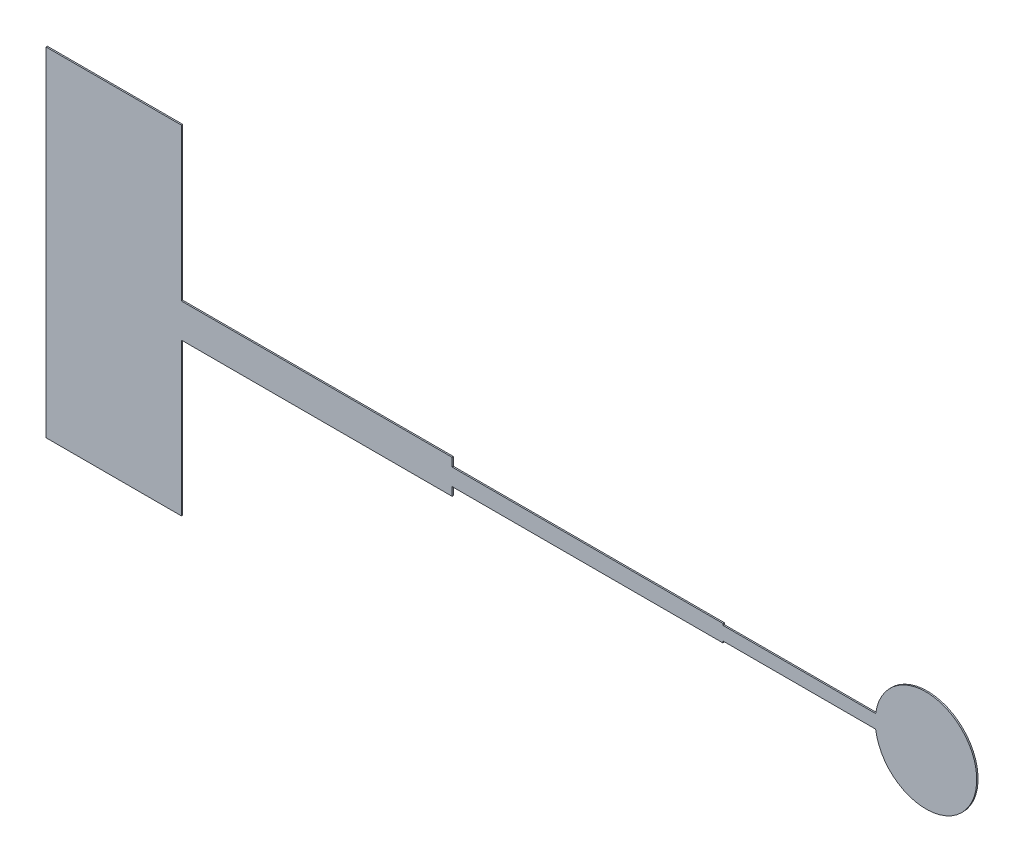
ISO-10303-21;
HEADER;
FILE_DESCRIPTION(('STEP AP214'),'2;1');
FILE_NAME('part.step','',(''),(''),'','','');
FILE_SCHEMA(('AUTOMOTIVE_DESIGN { 1 0 10303 214 1 1 1 1 }'));
ENDSEC;
DATA;
#1=APPLICATION_CONTEXT('core data for automotive mechanical design processes');
#2=APPLICATION_PROTOCOL_DEFINITION('international standard','automotive_design',2000,#1);
#3=PRODUCT_CONTEXT('',#1,'mechanical');
#4=PRODUCT('Part','Part','',(#3));
#5=PRODUCT_RELATED_PRODUCT_CATEGORY('part','',(#4));
#6=PRODUCT_DEFINITION_FORMATION('','',#4);
#7=PRODUCT_DEFINITION_CONTEXT('part definition',#1,'design');
#8=PRODUCT_DEFINITION('design','',#6,#7);
#9=PRODUCT_DEFINITION_SHAPE('','',#8);
#10=(LENGTH_UNIT() NAMED_UNIT(*) SI_UNIT(.MILLI.,.METRE.));
#11=(NAMED_UNIT(*) PLANE_ANGLE_UNIT() SI_UNIT($,.RADIAN.));
#12=(NAMED_UNIT(*) SI_UNIT($,.STERADIAN.) SOLID_ANGLE_UNIT());
#13=UNCERTAINTY_MEASURE_WITH_UNIT(LENGTH_MEASURE(1.E-05),#10,'distance_accuracy_value','');
#14=(GEOMETRIC_REPRESENTATION_CONTEXT(3) GLOBAL_UNCERTAINTY_ASSIGNED_CONTEXT((#13)) GLOBAL_UNIT_ASSIGNED_CONTEXT((#10,
#11,#12)) REPRESENTATION_CONTEXT('',''));
#15=CARTESIAN_POINT('',(0.,0.,0.));
#16=DIRECTION('',(0.,0.,1.));
#17=DIRECTION('',(1.,0.,0.));
#18=AXIS2_PLACEMENT_3D('',#15,#16,#17);
#19=CARTESIAN_POINT('',(1000.,-250.,-20.));
#20=DIRECTION('',(1.,0.,0.));
#21=DIRECTION('',(0.,1.,0.));
#22=AXIS2_PLACEMENT_3D('',#19,#20,#21);
#23=PLANE('',#22);
#24=DIRECTION('',(0.,1.,0.));
#25=VECTOR('',#24,1.);
#26=CARTESIAN_POINT('',(1000.,-250.,0.));
#27=LINE('',#26,#25);
#28=CARTESIAN_POINT('',(1000.,-2500.,0.));
#29=VERTEX_POINT('',#28);
#30=CARTESIAN_POINT('',(1000.,-250.,0.));
#31=VERTEX_POINT('',#30);
#32=EDGE_CURVE('E194',#29,#31,#27,.T.);
#33=ORIENTED_EDGE('',*,*,#32,.F.);
#34=DIRECTION('',(0.,0.,1.));
#35=VECTOR('',#34,1.);
#36=CARTESIAN_POINT('',(1000.,-2500.,-20.));
#37=LINE('',#36,#35);
#38=CARTESIAN_POINT('',(1000.,-2500.,-20.));
#39=VERTEX_POINT('',#38);
#40=EDGE_CURVE('E11',#39,#29,#37,.T.);
#41=ORIENTED_EDGE('',*,*,#40,.F.);
#42=DIRECTION('',(0.,1.,0.));
#43=VECTOR('',#42,1.);
#44=CARTESIAN_POINT('',(1000.,-250.,-20.));
#45=LINE('',#44,#43);
#46=CARTESIAN_POINT('',(1000.,-250.,-20.));
#47=VERTEX_POINT('',#46);
#48=EDGE_CURVE('E254',#39,#47,#45,.T.);
#49=ORIENTED_EDGE('',*,*,#48,.T.);
#50=DIRECTION('',(0.,0.,1.));
#51=VECTOR('',#50,1.);
#52=CARTESIAN_POINT('',(1000.,-250.,-20.));
#53=LINE('',#52,#51);
#54=EDGE_CURVE('E46',#47,#31,#53,.T.);
#55=ORIENTED_EDGE('',*,*,#54,.T.);
#56=EDGE_LOOP('',(#33,#41,#49,#55));
#57=FACE_BOUND('',#56,.T.);
#58=ADVANCED_FACE('F43',(#57),#23,.T.);
#59=CARTESIAN_POINT('',(-1000.,-2500.,-20.));
#60=DIRECTION('',(0.,-1.,0.));
#61=DIRECTION('',(0.,0.,-1.));
#62=AXIS2_PLACEMENT_3D('',#59,#60,#61);
#63=PLANE('',#62);
#64=DIRECTION('',(1.,0.,0.));
#65=VECTOR('',#64,1.);
#66=CARTESIAN_POINT('',(-1000.,-2500.,0.));
#67=LINE('',#66,#65);
#68=CARTESIAN_POINT('',(-1000.,-2500.,0.));
#69=VERTEX_POINT('',#68);
#70=EDGE_CURVE('E251',#69,#29,#67,.T.);
#71=ORIENTED_EDGE('',*,*,#70,.F.);
#72=DIRECTION('',(0.,0.,1.));
#73=VECTOR('',#72,1.);
#74=CARTESIAN_POINT('',(-1000.,-2500.,-20.));
#75=LINE('',#74,#73);
#76=CARTESIAN_POINT('',(-1000.,-2500.,-20.));
#77=VERTEX_POINT('',#76);
#78=EDGE_CURVE('E53',#77,#69,#75,.T.);
#79=ORIENTED_EDGE('',*,*,#78,.F.);
#80=DIRECTION('',(1.,0.,0.));
#81=VECTOR('',#80,1.);
#82=CARTESIAN_POINT('',(-1000.,-2500.,-20.));
#83=LINE('',#82,#81);
#84=EDGE_CURVE('E180',#77,#39,#83,.T.);
#85=ORIENTED_EDGE('',*,*,#84,.T.);
#86=ORIENTED_EDGE('',*,*,#40,.T.);
#87=EDGE_LOOP('',(#71,#79,#85,#86));
#88=FACE_BOUND('',#87,.T.);
#89=ADVANCED_FACE('F296',(#88),#63,.T.);
#90=CARTESIAN_POINT('',(-1000.,2500.,-20.));
#91=DIRECTION('',(-1.,0.,0.));
#92=DIRECTION('',(0.,-1.,0.));
#93=AXIS2_PLACEMENT_3D('',#90,#91,#92);
#94=PLANE('',#93);
#95=DIRECTION('',(0.,-1.,0.));
#96=VECTOR('',#95,1.);
#97=CARTESIAN_POINT('',(-1000.,2500.,0.));
#98=LINE('',#97,#96);
#99=CARTESIAN_POINT('',(-1000.,2500.,0.));
#100=VERTEX_POINT('',#99);
#101=EDGE_CURVE('E166',#100,#69,#98,.T.);
#102=ORIENTED_EDGE('',*,*,#101,.F.);
#103=DIRECTION('',(0.,0.,1.));
#104=VECTOR('',#103,1.);
#105=CARTESIAN_POINT('',(-1000.,2500.,-20.));
#106=LINE('',#105,#104);
#107=CARTESIAN_POINT('',(-1000.,2500.,-20.));
#108=VERTEX_POINT('',#107);
#109=EDGE_CURVE('E161',#108,#100,#106,.T.);
#110=ORIENTED_EDGE('',*,*,#109,.F.);
#111=DIRECTION('',(0.,-1.,0.));
#112=VECTOR('',#111,1.);
#113=CARTESIAN_POINT('',(-1000.,2500.,-20.));
#114=LINE('',#113,#112);
#115=EDGE_CURVE('E164',#108,#77,#114,.T.);
#116=ORIENTED_EDGE('',*,*,#115,.T.);
#117=ORIENTED_EDGE('',*,*,#78,.T.);
#118=EDGE_LOOP('',(#102,#110,#116,#117));
#119=FACE_BOUND('',#118,.T.);
#120=ADVANCED_FACE('F163',(#119),#94,.T.);
#121=CARTESIAN_POINT('',(-1000.,2500.,-20.));
#122=DIRECTION('',(0.,1.,0.));
#123=DIRECTION('',(0.,0.,1.));
#124=AXIS2_PLACEMENT_3D('',#121,#122,#123);
#125=PLANE('',#124);
#126=DIRECTION('',(-1.,0.,0.));
#127=VECTOR('',#126,1.);
#128=CARTESIAN_POINT('',(-1000.,2500.,0.));
#129=LINE('',#128,#127);
#130=CARTESIAN_POINT('',(1000.,2500.,0.));
#131=VERTEX_POINT('',#130);
#132=EDGE_CURVE('E246',#131,#100,#129,.T.);
#133=ORIENTED_EDGE('',*,*,#132,.F.);
#134=DIRECTION('',(0.,0.,1.));
#135=VECTOR('',#134,1.);
#136=CARTESIAN_POINT('',(1000.,2500.,-20.));
#137=LINE('',#136,#135);
#138=CARTESIAN_POINT('',(1000.,2500.,-20.));
#139=VERTEX_POINT('',#138);
#140=EDGE_CURVE('E172',#139,#131,#137,.T.);
#141=ORIENTED_EDGE('',*,*,#140,.F.);
#142=DIRECTION('',(-1.,0.,0.));
#143=VECTOR('',#142,1.);
#144=CARTESIAN_POINT('',(-1000.,2500.,-20.));
#145=LINE('',#144,#143);
#146=EDGE_CURVE('E178',#139,#108,#145,.T.);
#147=ORIENTED_EDGE('',*,*,#146,.T.);
#148=ORIENTED_EDGE('',*,*,#109,.T.);
#149=EDGE_LOOP('',(#133,#141,#147,#148));
#150=FACE_BOUND('',#149,.T.);
#151=ADVANCED_FACE('F183',(#150),#125,.T.);
#152=CARTESIAN_POINT('',(1000.,2500.,-20.));
#153=DIRECTION('',(1.,0.,0.));
#154=DIRECTION('',(0.,1.,0.));
#155=AXIS2_PLACEMENT_3D('',#152,#153,#154);
#156=PLANE('',#155);
#157=DIRECTION('',(0.,1.,0.));
#158=VECTOR('',#157,1.);
#159=CARTESIAN_POINT('',(1000.,2500.,0.));
#160=LINE('',#159,#158);
#161=CARTESIAN_POINT('',(1000.,250.,0.));
#162=VERTEX_POINT('',#161);
#163=EDGE_CURVE('E242',#162,#131,#160,.T.);
#164=ORIENTED_EDGE('',*,*,#163,.F.);
#165=DIRECTION('',(0.,0.,1.));
#166=VECTOR('',#165,1.);
#167=CARTESIAN_POINT('',(1000.,250.,-20.));
#168=LINE('',#167,#166);
#169=CARTESIAN_POINT('',(1000.,250.,-20.));
#170=VERTEX_POINT('',#169);
#171=EDGE_CURVE('E260',#170,#162,#168,.T.);
#172=ORIENTED_EDGE('',*,*,#171,.F.);
#173=DIRECTION('',(0.,1.,0.));
#174=VECTOR('',#173,1.);
#175=CARTESIAN_POINT('',(1000.,2500.,-20.));
#176=LINE('',#175,#174);
#177=EDGE_CURVE('E185',#170,#139,#176,.T.);
#178=ORIENTED_EDGE('',*,*,#177,.T.);
#179=ORIENTED_EDGE('',*,*,#140,.T.);
#180=EDGE_LOOP('',(#164,#172,#178,#179));
#181=FACE_BOUND('',#180,.T.);
#182=ADVANCED_FACE('F309',(#181),#156,.T.);
#183=CARTESIAN_POINT('',(1000.,250.,-20.));
#184=DIRECTION('',(0.,1.,0.));
#185=DIRECTION('',(0.,0.,1.));
#186=AXIS2_PLACEMENT_3D('',#183,#184,#185);
#187=PLANE('',#186);
#188=DIRECTION('',(-1.,0.,0.));
#189=VECTOR('',#188,1.);
#190=CARTESIAN_POINT('',(1000.,250.,0.));
#191=LINE('',#190,#189);
#192=CARTESIAN_POINT('',(5000.,250.,0.));
#193=VERTEX_POINT('',#192);
#194=EDGE_CURVE('E238',#193,#162,#191,.T.);
#195=ORIENTED_EDGE('',*,*,#194,.F.);
#196=DIRECTION('',(0.,0.,1.));
#197=VECTOR('',#196,1.);
#198=CARTESIAN_POINT('',(5000.,250.,-20.));
#199=LINE('',#198,#197);
#200=CARTESIAN_POINT('',(5000.,250.,-20.));
#201=VERTEX_POINT('',#200);
#202=EDGE_CURVE('E263',#201,#193,#199,.T.);
#203=ORIENTED_EDGE('',*,*,#202,.F.);
#204=DIRECTION('',(-1.,0.,0.));
#205=VECTOR('',#204,1.);
#206=CARTESIAN_POINT('',(1000.,250.,-20.));
#207=LINE('',#206,#205);
#208=EDGE_CURVE('E188',#201,#170,#207,.T.);
#209=ORIENTED_EDGE('',*,*,#208,.T.);
#210=ORIENTED_EDGE('',*,*,#171,.T.);
#211=EDGE_LOOP('',(#195,#203,#209,#210));
#212=FACE_BOUND('',#211,.T.);
#213=ADVANCED_FACE('F312',(#212),#187,.T.);
#214=CARTESIAN_POINT('',(5000.,250.,-20.));
#215=DIRECTION('',(1.,0.,0.));
#216=DIRECTION('',(0.,0.,-1.));
#217=AXIS2_PLACEMENT_3D('',#214,#215,#216);
#218=PLANE('',#217);
#219=DIRECTION('',(0.,1.,0.));
#220=VECTOR('',#219,1.);
#221=CARTESIAN_POINT('',(5000.,250.,0.));
#222=LINE('',#221,#220);
#223=CARTESIAN_POINT('',(5000.,125.,0.));
#224=VERTEX_POINT('',#223);
#225=EDGE_CURVE('E234',#224,#193,#222,.T.);
#226=ORIENTED_EDGE('',*,*,#225,.F.);
#227=DIRECTION('',(0.,0.,1.));
#228=VECTOR('',#227,1.);
#229=CARTESIAN_POINT('',(5000.,125.,-20.));
#230=LINE('',#229,#228);
#231=CARTESIAN_POINT('',(5000.,125.,-20.));
#232=VERTEX_POINT('',#231);
#233=EDGE_CURVE('E266',#232,#224,#230,.T.);
#234=ORIENTED_EDGE('',*,*,#233,.F.);
#235=DIRECTION('',(0.,1.,0.));
#236=VECTOR('',#235,1.);
#237=CARTESIAN_POINT('',(5000.,250.,-20.));
#238=LINE('',#237,#236);
#239=EDGE_CURVE('E529',#232,#201,#238,.T.);
#240=ORIENTED_EDGE('',*,*,#239,.T.);
#241=ORIENTED_EDGE('',*,*,#202,.T.);
#242=EDGE_LOOP('',(#226,#234,#240,#241));
#243=FACE_BOUND('',#242,.T.);
#244=ADVANCED_FACE('F316',(#243),#218,.T.);
#245=CARTESIAN_POINT('',(5000.,125.,-20.));
#246=DIRECTION('',(0.,1.,0.));
#247=DIRECTION('',(-1.,0.,0.));
#248=AXIS2_PLACEMENT_3D('',#245,#246,#247);
#249=PLANE('',#248);
#250=DIRECTION('',(-1.,0.,0.));
#251=VECTOR('',#250,1.);
#252=CARTESIAN_POINT('',(5000.,125.,0.));
#253=LINE('',#252,#251);
#254=CARTESIAN_POINT('',(9000.,125.000000000002,0.));
#255=VERTEX_POINT('',#254);
#256=EDGE_CURVE('E230',#255,#224,#253,.T.);
#257=ORIENTED_EDGE('',*,*,#256,.F.);
#258=DIRECTION('',(0.,0.,1.));
#259=VECTOR('',#258,1.);
#260=CARTESIAN_POINT('',(9000.,125.000000000002,-20.));
#261=LINE('',#260,#259);
#262=CARTESIAN_POINT('',(9000.,125.000000000002,-20.));
#263=VERTEX_POINT('',#262);
#264=EDGE_CURVE('E269',#263,#255,#261,.T.);
#265=ORIENTED_EDGE('',*,*,#264,.F.);
#266=DIRECTION('',(-1.,0.,0.));
#267=VECTOR('',#266,1.);
#268=CARTESIAN_POINT('',(5000.,125.,-20.));
#269=LINE('',#268,#267);
#270=EDGE_CURVE('E525',#263,#232,#269,.T.);
#271=ORIENTED_EDGE('',*,*,#270,.T.);
#272=ORIENTED_EDGE('',*,*,#233,.T.);
#273=EDGE_LOOP('',(#257,#265,#271,#272));
#274=FACE_BOUND('',#273,.T.);
#275=ADVANCED_FACE('F320',(#274),#249,.T.);
#276=CARTESIAN_POINT('',(9000.,125.000000000002,-20.));
#277=DIRECTION('',(1.,0.,0.));
#278=DIRECTION('',(0.,0.,-1.));
#279=AXIS2_PLACEMENT_3D('',#276,#277,#278);
#280=PLANE('',#279);
#281=DIRECTION('',(0.,1.,0.));
#282=VECTOR('',#281,1.);
#283=CARTESIAN_POINT('',(9000.,125.000000000002,0.));
#284=LINE('',#283,#282);
#285=CARTESIAN_POINT('',(9000.,100.000000000003,0.));
#286=VERTEX_POINT('',#285);
#287=EDGE_CURVE('E226',#286,#255,#284,.T.);
#288=ORIENTED_EDGE('',*,*,#287,.F.);
#289=DIRECTION('',(0.,0.,1.));
#290=VECTOR('',#289,1.);
#291=CARTESIAN_POINT('',(9000.,100.000000000003,-20.));
#292=LINE('',#291,#290);
#293=CARTESIAN_POINT('',(9000.,100.000000000003,-20.));
#294=VERTEX_POINT('',#293);
#295=EDGE_CURVE('E272',#294,#286,#292,.T.);
#296=ORIENTED_EDGE('',*,*,#295,.F.);
#297=DIRECTION('',(0.,1.,0.));
#298=VECTOR('',#297,1.);
#299=CARTESIAN_POINT('',(9000.,125.000000000002,-20.));
#300=LINE('',#299,#298);
#301=EDGE_CURVE('E539',#294,#263,#300,.T.);
#302=ORIENTED_EDGE('',*,*,#301,.T.);
#303=ORIENTED_EDGE('',*,*,#264,.T.);
#304=EDGE_LOOP('',(#288,#296,#302,#303));
#305=FACE_BOUND('',#304,.T.);
#306=ADVANCED_FACE('F324',(#305),#280,.T.);
#307=CARTESIAN_POINT('',(9000.,100.000000000003,-20.));
#308=DIRECTION('',(0.,1.,0.));
#309=DIRECTION('',(-1.,0.,0.));
#310=AXIS2_PLACEMENT_3D('',#307,#308,#309);
#311=PLANE('',#310);
#312=DIRECTION('',(-1.,0.,0.));
#313=VECTOR('',#312,1.);
#314=CARTESIAN_POINT('',(9000.,100.000000000003,0.));
#315=LINE('',#314,#313);
#316=CARTESIAN_POINT('',(11256.6965626341,100.000000000003,0.));
#317=VERTEX_POINT('',#316);
#318=EDGE_CURVE('E222',#317,#286,#315,.T.);
#319=ORIENTED_EDGE('',*,*,#318,.F.);
#320=DIRECTION('',(0.,0.,1.));
#321=VECTOR('',#320,1.);
#322=CARTESIAN_POINT('',(11256.6965626341,100.000000000003,-20.));
#323=LINE('',#322,#321);
#324=CARTESIAN_POINT('',(11256.6965626341,100.000000000003,-20.));
#325=VERTEX_POINT('',#324);
#326=EDGE_CURVE('E275',#325,#317,#323,.T.);
#327=ORIENTED_EDGE('',*,*,#326,.F.);
#328=DIRECTION('',(-1.,0.,0.));
#329=VECTOR('',#328,1.);
#330=CARTESIAN_POINT('',(9000.,100.000000000003,-20.));
#331=LINE('',#330,#329);
#332=EDGE_CURVE('E518',#325,#294,#331,.T.);
#333=ORIENTED_EDGE('',*,*,#332,.T.);
#334=ORIENTED_EDGE('',*,*,#295,.T.);
#335=EDGE_LOOP('',(#319,#327,#333,#334));
#336=FACE_BOUND('',#335,.T.);
#337=ADVANCED_FACE('F328',(#336),#311,.T.);
#338=CARTESIAN_POINT('',(12000.,2.44249065417534E-12,-20.));
#339=DIRECTION('',(0.,0.,1.));
#340=DIRECTION('',(1.,0.,0.));
#341=AXIS2_PLACEMENT_3D('',#338,#339,#340);
#342=CYLINDRICAL_SURFACE('',#341,749.999999999999);
#343=CARTESIAN_POINT('',(12000.,2.44249065417534E-12,0.));
#344=DIRECTION('',(0.,0.,1.));
#345=DIRECTION('',(1.,0.,0.));
#346=AXIS2_PLACEMENT_3D('',#343,#344,#345);
#347=CIRCLE('',#346,749.999999999999);
#348=CARTESIAN_POINT('',(11256.6965626341,-99.9999999999971,0.));
#349=VERTEX_POINT('',#348);
#350=EDGE_CURVE('E218',#349,#317,#347,.T.);
#351=ORIENTED_EDGE('',*,*,#350,.F.);
#352=DIRECTION('',(0.,0.,1.));
#353=VECTOR('',#352,1.);
#354=CARTESIAN_POINT('',(11256.6965626341,-99.9999999999971,-20.));
#355=LINE('',#354,#353);
#356=CARTESIAN_POINT('',(11256.6965626341,-99.9999999999971,-20.));
#357=VERTEX_POINT('',#356);
#358=EDGE_CURVE('E278',#357,#349,#355,.T.);
#359=ORIENTED_EDGE('',*,*,#358,.F.);
#360=CARTESIAN_POINT('',(12000.,2.44249065417534E-12,-20.));
#361=DIRECTION('',(0.,0.,1.));
#362=DIRECTION('',(1.,0.,0.));
#363=AXIS2_PLACEMENT_3D('',#360,#361,#362);
#364=CIRCLE('',#363,749.999999999999);
#365=EDGE_CURVE('E514',#357,#325,#364,.T.);
#366=ORIENTED_EDGE('',*,*,#365,.T.);
#367=ORIENTED_EDGE('',*,*,#326,.T.);
#368=EDGE_LOOP('',(#351,#359,#366,#367));
#369=FACE_BOUND('',#368,.T.);
#370=ADVANCED_FACE('F332',(#369),#342,.T.);
#371=CARTESIAN_POINT('',(9000.,-99.9999999999962,-20.));
#372=DIRECTION('',(0.,-1.,0.));
#373=DIRECTION('',(1.,0.,0.));
#374=AXIS2_PLACEMENT_3D('',#371,#372,#373);
#375=PLANE('',#374);
#376=DIRECTION('',(1.,0.,0.));
#377=VECTOR('',#376,1.);
#378=CARTESIAN_POINT('',(9000.,-99.9999999999962,0.));
#379=LINE('',#378,#377);
#380=CARTESIAN_POINT('',(9000.,-99.9999999999962,0.));
#381=VERTEX_POINT('',#380);
#382=EDGE_CURVE('E214',#381,#349,#379,.T.);
#383=ORIENTED_EDGE('',*,*,#382,.F.);
#384=DIRECTION('',(0.,0.,1.));
#385=VECTOR('',#384,1.);
#386=CARTESIAN_POINT('',(9000.,-99.9999999999962,-20.));
#387=LINE('',#386,#385);
#388=CARTESIAN_POINT('',(9000.,-99.9999999999962,-20.));
#389=VERTEX_POINT('',#388);
#390=EDGE_CURVE('E281',#389,#381,#387,.T.);
#391=ORIENTED_EDGE('',*,*,#390,.F.);
#392=DIRECTION('',(1.,0.,0.));
#393=VECTOR('',#392,1.);
#394=CARTESIAN_POINT('',(9000.,-99.9999999999962,-20.));
#395=LINE('',#394,#393);
#396=EDGE_CURVE('E546',#389,#357,#395,.T.);
#397=ORIENTED_EDGE('',*,*,#396,.T.);
#398=ORIENTED_EDGE('',*,*,#358,.T.);
#399=EDGE_LOOP('',(#383,#391,#397,#398));
#400=FACE_BOUND('',#399,.T.);
#401=ADVANCED_FACE('F336',(#400),#375,.T.);
#402=CARTESIAN_POINT('',(9000.,-99.9999999999962,-20.));
#403=DIRECTION('',(1.,0.,0.));
#404=DIRECTION('',(0.,0.,-1.));
#405=AXIS2_PLACEMENT_3D('',#402,#403,#404);
#406=PLANE('',#405);
#407=DIRECTION('',(0.,1.,0.));
#408=VECTOR('',#407,1.);
#409=CARTESIAN_POINT('',(9000.,-99.9999999999962,0.));
#410=LINE('',#409,#408);
#411=CARTESIAN_POINT('',(9000.,-124.999999999998,0.));
#412=VERTEX_POINT('',#411);
#413=EDGE_CURVE('E210',#412,#381,#410,.T.);
#414=ORIENTED_EDGE('',*,*,#413,.F.);
#415=DIRECTION('',(0.,0.,1.));
#416=VECTOR('',#415,1.);
#417=CARTESIAN_POINT('',(9000.,-124.999999999998,-20.));
#418=LINE('',#417,#416);
#419=CARTESIAN_POINT('',(9000.,-124.999999999998,-20.));
#420=VERTEX_POINT('',#419);
#421=EDGE_CURVE('E284',#420,#412,#418,.T.);
#422=ORIENTED_EDGE('',*,*,#421,.F.);
#423=DIRECTION('',(0.,1.,0.));
#424=VECTOR('',#423,1.);
#425=CARTESIAN_POINT('',(9000.,-99.9999999999962,-20.));
#426=LINE('',#425,#424);
#427=EDGE_CURVE('E507',#420,#389,#426,.T.);
#428=ORIENTED_EDGE('',*,*,#427,.T.);
#429=ORIENTED_EDGE('',*,*,#390,.T.);
#430=EDGE_LOOP('',(#414,#422,#428,#429));
#431=FACE_BOUND('',#430,.T.);
#432=ADVANCED_FACE('F340',(#431),#406,.T.);
#433=CARTESIAN_POINT('',(5000.,-124.999999999995,-20.));
#434=DIRECTION('',(0.,-1.,0.));
#435=DIRECTION('',(1.,0.,0.));
#436=AXIS2_PLACEMENT_3D('',#433,#434,#435);
#437=PLANE('',#436);
#438=DIRECTION('',(1.,0.,0.));
#439=VECTOR('',#438,1.);
#440=CARTESIAN_POINT('',(5000.,-124.999999999995,0.));
#441=LINE('',#440,#439);
#442=CARTESIAN_POINT('',(5000.,-124.999999999995,0.));
#443=VERTEX_POINT('',#442);
#444=EDGE_CURVE('E206',#443,#412,#441,.T.);
#445=ORIENTED_EDGE('',*,*,#444,.F.);
#446=DIRECTION('',(0.,0.,1.));
#447=VECTOR('',#446,1.);
#448=CARTESIAN_POINT('',(5000.,-124.999999999995,-20.));
#449=LINE('',#448,#447);
#450=CARTESIAN_POINT('',(5000.,-124.999999999995,-20.));
#451=VERTEX_POINT('',#450);
#452=EDGE_CURVE('E287',#451,#443,#449,.T.);
#453=ORIENTED_EDGE('',*,*,#452,.F.);
#454=DIRECTION('',(1.,0.,0.));
#455=VECTOR('',#454,1.);
#456=CARTESIAN_POINT('',(5000.,-124.999999999995,-20.));
#457=LINE('',#456,#455);
#458=EDGE_CURVE('E503',#451,#420,#457,.T.);
#459=ORIENTED_EDGE('',*,*,#458,.T.);
#460=ORIENTED_EDGE('',*,*,#421,.T.);
#461=EDGE_LOOP('',(#445,#453,#459,#460));
#462=FACE_BOUND('',#461,.T.);
#463=ADVANCED_FACE('F344',(#462),#437,.T.);
#464=CARTESIAN_POINT('',(5000.,-124.999999999995,-20.));
#465=DIRECTION('',(1.,0.,0.));
#466=DIRECTION('',(0.,0.,-1.));
#467=AXIS2_PLACEMENT_3D('',#464,#465,#466);
#468=PLANE('',#467);
#469=DIRECTION('',(0.,1.,0.));
#470=VECTOR('',#469,1.);
#471=CARTESIAN_POINT('',(5000.,-124.999999999995,0.));
#472=LINE('',#471,#470);
#473=CARTESIAN_POINT('',(5000.,-250.000000000013,0.));
#474=VERTEX_POINT('',#473);
#475=EDGE_CURVE('E202',#474,#443,#472,.T.);
#476=ORIENTED_EDGE('',*,*,#475,.F.);
#477=DIRECTION('',(0.,0.,1.));
#478=VECTOR('',#477,1.);
#479=CARTESIAN_POINT('',(5000.,-250.000000000013,-20.));
#480=LINE('',#479,#478);
#481=CARTESIAN_POINT('',(5000.,-250.000000000013,-20.));
#482=VERTEX_POINT('',#481);
#483=EDGE_CURVE('E289',#482,#474,#480,.T.);
#484=ORIENTED_EDGE('',*,*,#483,.F.);
#485=DIRECTION('',(0.,1.,0.));
#486=VECTOR('',#485,1.);
#487=CARTESIAN_POINT('',(5000.,-124.999999999995,-20.));
#488=LINE('',#487,#486);
#489=EDGE_CURVE('E553',#482,#451,#488,.T.);
#490=ORIENTED_EDGE('',*,*,#489,.T.);
#491=ORIENTED_EDGE('',*,*,#452,.T.);
#492=EDGE_LOOP('',(#476,#484,#490,#491));
#493=FACE_BOUND('',#492,.T.);
#494=ADVANCED_FACE('F348',(#493),#468,.T.);
#495=CARTESIAN_POINT('',(1000.,-250.,-20.));
#496=DIRECTION('',(0.,-1.,0.));
#497=DIRECTION('',(1.,0.,0.));
#498=AXIS2_PLACEMENT_3D('',#495,#496,#497);
#499=PLANE('',#498);
#500=DIRECTION('',(1.,0.,0.));
#501=VECTOR('',#500,1.);
#502=CARTESIAN_POINT('',(1000.,-250.,0.));
#503=LINE('',#502,#501);
#504=EDGE_CURVE('E198',#31,#474,#503,.T.);
#505=ORIENTED_EDGE('',*,*,#504,.F.);
#506=ORIENTED_EDGE('',*,*,#54,.F.);
#507=DIRECTION('',(1.,0.,0.));
#508=VECTOR('',#507,1.);
#509=CARTESIAN_POINT('',(1000.,-250.,-20.));
#510=LINE('',#509,#508);
#511=EDGE_CURVE('E556',#47,#482,#510,.T.);
#512=ORIENTED_EDGE('',*,*,#511,.T.);
#513=ORIENTED_EDGE('',*,*,#483,.T.);
#514=EDGE_LOOP('',(#505,#506,#512,#513));
#515=FACE_BOUND('',#514,.T.);
#516=ADVANCED_FACE('F293',(#515),#499,.T.);
#517=CARTESIAN_POINT('',(12000.,2.44249065417534E-12,-20.));
#518=DIRECTION('',(0.,0.,1.));
#519=DIRECTION('',(1.,0.,0.));
#520=AXIS2_PLACEMENT_3D('',#517,#518,#519);
#521=PLANE('',#520);
#522=ORIENTED_EDGE('',*,*,#48,.F.);
#523=ORIENTED_EDGE('',*,*,#84,.F.);
#524=ORIENTED_EDGE('',*,*,#115,.F.);
#525=ORIENTED_EDGE('',*,*,#146,.F.);
#526=ORIENTED_EDGE('',*,*,#177,.F.);
#527=ORIENTED_EDGE('',*,*,#208,.F.);
#528=ORIENTED_EDGE('',*,*,#239,.F.);
#529=ORIENTED_EDGE('',*,*,#270,.F.);
#530=ORIENTED_EDGE('',*,*,#301,.F.);
#531=ORIENTED_EDGE('',*,*,#332,.F.);
#532=ORIENTED_EDGE('',*,*,#365,.F.);
#533=ORIENTED_EDGE('',*,*,#396,.F.);
#534=ORIENTED_EDGE('',*,*,#427,.F.);
#535=ORIENTED_EDGE('',*,*,#458,.F.);
#536=ORIENTED_EDGE('',*,*,#489,.F.);
#537=ORIENTED_EDGE('',*,*,#511,.F.);
#538=EDGE_LOOP('',(#522,#523,#524,#525,#526,#527,#528,#529,#530,#531,#532,#533,#534,#535,#536,#537));
#539=FACE_BOUND('',#538,.T.);
#540=ADVANCED_FACE('F176',(#539),#521,.F.);
#541=CARTESIAN_POINT('',(12000.,2.44249065417534E-12,0.));
#542=DIRECTION('',(0.,0.,1.));
#543=DIRECTION('',(1.,0.,0.));
#544=AXIS2_PLACEMENT_3D('',#541,#542,#543);
#545=PLANE('',#544);
#546=ORIENTED_EDGE('',*,*,#32,.T.);
#547=ORIENTED_EDGE('',*,*,#504,.T.);
#548=ORIENTED_EDGE('',*,*,#475,.T.);
#549=ORIENTED_EDGE('',*,*,#444,.T.);
#550=ORIENTED_EDGE('',*,*,#413,.T.);
#551=ORIENTED_EDGE('',*,*,#382,.T.);
#552=ORIENTED_EDGE('',*,*,#350,.T.);
#553=ORIENTED_EDGE('',*,*,#318,.T.);
#554=ORIENTED_EDGE('',*,*,#287,.T.);
#555=ORIENTED_EDGE('',*,*,#256,.T.);
#556=ORIENTED_EDGE('',*,*,#225,.T.);
#557=ORIENTED_EDGE('',*,*,#194,.T.);
#558=ORIENTED_EDGE('',*,*,#163,.T.);
#559=ORIENTED_EDGE('',*,*,#132,.T.);
#560=ORIENTED_EDGE('',*,*,#101,.T.);
#561=ORIENTED_EDGE('',*,*,#70,.T.);
#562=EDGE_LOOP('',(#546,#547,#548,#549,#550,#551,#552,#553,#554,#555,#556,#557,#558,#559,#560,#561));
#563=FACE_BOUND('',#562,.T.);
#564=ADVANCED_FACE('F295',(#563),#545,.T.);
#565=CLOSED_SHELL('',(#58,#89,#120,#151,#182,#213,#244,#275,#306,#337,#370,#401,#432,#463,#494,
#516,#540,#564));
#566=MANIFOLD_SOLID_BREP('B2',#565);
#567=ADVANCED_BREP_SHAPE_REPRESENTATION('',(#18,#566),#14);
#568=SHAPE_DEFINITION_REPRESENTATION(#9,#567);
ENDSEC;
END-ISO-10303-21;
